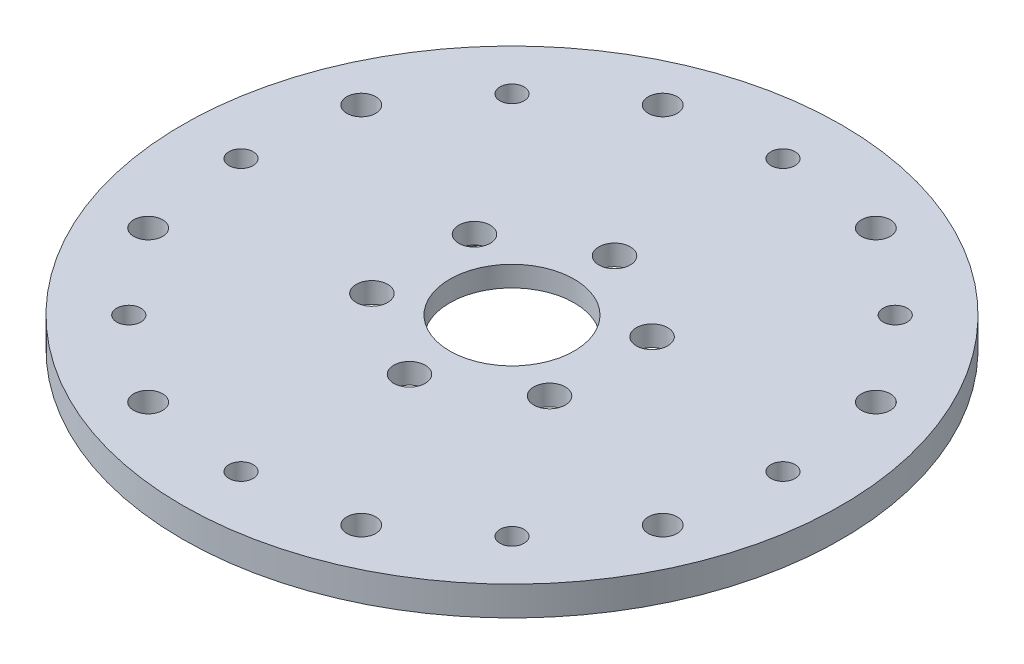
ISO-10303-21;
HEADER;
FILE_DESCRIPTION(('STEP AP214'),'2;1');
FILE_NAME('part.step','',(''),(''),'','','');
FILE_SCHEMA(('AUTOMOTIVE_DESIGN { 1 0 10303 214 1 1 1 1 }'));
ENDSEC;
DATA;
#1=APPLICATION_CONTEXT('core data for automotive mechanical design processes');
#2=APPLICATION_PROTOCOL_DEFINITION('international standard','automotive_design',2000,#1);
#3=PRODUCT_CONTEXT('',#1,'mechanical');
#4=PRODUCT('Part','Part','',(#3));
#5=PRODUCT_RELATED_PRODUCT_CATEGORY('part','',(#4));
#6=PRODUCT_DEFINITION_FORMATION('','',#4);
#7=PRODUCT_DEFINITION_CONTEXT('part definition',#1,'design');
#8=PRODUCT_DEFINITION('design','',#6,#7);
#9=PRODUCT_DEFINITION_SHAPE('','',#8);
#10=(LENGTH_UNIT() NAMED_UNIT(*) SI_UNIT(.MILLI.,.METRE.));
#11=(NAMED_UNIT(*) PLANE_ANGLE_UNIT() SI_UNIT($,.RADIAN.));
#12=(NAMED_UNIT(*) SI_UNIT($,.STERADIAN.) SOLID_ANGLE_UNIT());
#13=UNCERTAINTY_MEASURE_WITH_UNIT(LENGTH_MEASURE(1.E-05),#10,'distance_accuracy_value','');
#14=(GEOMETRIC_REPRESENTATION_CONTEXT(3) GLOBAL_UNCERTAINTY_ASSIGNED_CONTEXT((#13)) GLOBAL_UNIT_ASSIGNED_CONTEXT((#10,
#11,#12)) REPRESENTATION_CONTEXT('',''));
#15=CARTESIAN_POINT('',(0.,0.,0.));
#16=DIRECTION('',(0.,0.,1.));
#17=DIRECTION('',(1.,0.,0.));
#18=AXIS2_PLACEMENT_3D('',#15,#16,#17);
#19=CARTESIAN_POINT('',(0.,0.,-14.));
#20=DIRECTION('',(0.,1.,0.));
#21=DIRECTION('',(0.,0.,1.));
#22=AXIS2_PLACEMENT_3D('',#19,#20,#21);
#23=CYLINDRICAL_SURFACE('',#22,2.15);
#24=CARTESIAN_POINT('',(0.,4.,-14.));
#25=DIRECTION('',(0.,1.,0.));
#26=DIRECTION('',(0.,0.,1.));
#27=AXIS2_PLACEMENT_3D('',#24,#25,#26);
#28=CIRCLE('',#27,2.15);
#29=CARTESIAN_POINT('',(0.,4.,-11.85));
#30=VERTEX_POINT('',#29);
#31=EDGE_CURVE('E52',#30,#30,#28,.T.);
#32=ORIENTED_EDGE('',*,*,#31,.T.);
#33=EDGE_LOOP('',(#32));
#34=FACE_BOUND('',#33,.T.);
#35=CARTESIAN_POINT('',(0.,1.2,-14.));
#36=DIRECTION('',(0.,-1.,0.));
#37=DIRECTION('',(0.,0.,-1.));
#38=AXIS2_PLACEMENT_3D('',#35,#36,#37);
#39=CIRCLE('',#38,2.15);
#40=CARTESIAN_POINT('',(0.,1.2,-16.15));
#41=VERTEX_POINT('',#40);
#42=EDGE_CURVE('E115',#41,#41,#39,.F.);
#43=ORIENTED_EDGE('',*,*,#42,.F.);
#44=EDGE_LOOP('',(#43));
#45=FACE_BOUND('',#44,.T.);
#46=ADVANCED_FACE('F39',(#34,#45),#23,.F.);
#47=CARTESIAN_POINT('',(-12.1243556529822,0.,-6.99999999999997));
#48=DIRECTION('',(0.,1.,0.));
#49=DIRECTION('',(0.,0.,1.));
#50=AXIS2_PLACEMENT_3D('',#47,#48,#49);
#51=CYLINDRICAL_SURFACE('',#50,2.15);
#52=CARTESIAN_POINT('',(-12.1243556529822,4.,-6.99999999999997));
#53=DIRECTION('',(0.,1.,0.));
#54=DIRECTION('',(0.86602540378444,0.,0.499999999999998));
#55=AXIS2_PLACEMENT_3D('',#52,#53,#54);
#56=CIRCLE('',#55,2.15);
#57=CARTESIAN_POINT('',(-10.2624010348456,4.,-5.92499999999998));
#58=VERTEX_POINT('',#57);
#59=EDGE_CURVE('E56',#58,#58,#56,.T.);
#60=ORIENTED_EDGE('',*,*,#59,.T.);
#61=EDGE_LOOP('',(#60));
#62=FACE_BOUND('',#61,.T.);
#63=CARTESIAN_POINT('',(-12.1243556529822,1.2,-6.99999999999997));
#64=DIRECTION('',(0.,-1.,0.));
#65=DIRECTION('',(0.,0.,-1.));
#66=AXIS2_PLACEMENT_3D('',#63,#64,#65);
#67=CIRCLE('',#66,2.15);
#68=CARTESIAN_POINT('',(-12.1243556529822,1.2,-9.14999999999997));
#69=VERTEX_POINT('',#68);
#70=EDGE_CURVE('E125',#69,#69,#67,.F.);
#71=ORIENTED_EDGE('',*,*,#70,.F.);
#72=EDGE_LOOP('',(#71));
#73=FACE_BOUND('',#72,.T.);
#74=ADVANCED_FACE('F255',(#62,#73),#51,.F.);
#75=CARTESIAN_POINT('',(-12.1243556529821,0.,7.00000000000006));
#76=DIRECTION('',(0.,1.,0.));
#77=DIRECTION('',(0.,0.,1.));
#78=AXIS2_PLACEMENT_3D('',#75,#76,#77);
#79=CYLINDRICAL_SURFACE('',#78,2.15);
#80=CARTESIAN_POINT('',(-12.1243556529821,4.,7.00000000000006));
#81=DIRECTION('',(0.,1.,0.));
#82=DIRECTION('',(0.866025403784436,0.,-0.500000000000004));
#83=AXIS2_PLACEMENT_3D('',#80,#81,#82);
#84=CIRCLE('',#83,2.15);
#85=CARTESIAN_POINT('',(-10.2624010348456,4.,5.92500000000005));
#86=VERTEX_POINT('',#85);
#87=EDGE_CURVE('E59',#86,#86,#84,.T.);
#88=ORIENTED_EDGE('',*,*,#87,.T.);
#89=EDGE_LOOP('',(#88));
#90=FACE_BOUND('',#89,.T.);
#91=CARTESIAN_POINT('',(-12.1243556529821,1.2,7.00000000000006));
#92=DIRECTION('',(0.,-1.,0.));
#93=DIRECTION('',(0.,0.,-1.));
#94=AXIS2_PLACEMENT_3D('',#91,#92,#93);
#95=CIRCLE('',#94,2.15);
#96=CARTESIAN_POINT('',(-12.1243556529821,1.2,4.85000000000006));
#97=VERTEX_POINT('',#96);
#98=EDGE_CURVE('E128',#97,#97,#95,.F.);
#99=ORIENTED_EDGE('',*,*,#98,.F.);
#100=EDGE_LOOP('',(#99));
#101=FACE_BOUND('',#100,.T.);
#102=ADVANCED_FACE('F311',(#90,#101),#79,.F.);
#103=CARTESIAN_POINT('',(0.,0.,14.));
#104=DIRECTION('',(0.,1.,0.));
#105=DIRECTION('',(0.,0.,1.));
#106=AXIS2_PLACEMENT_3D('',#103,#104,#105);
#107=CYLINDRICAL_SURFACE('',#106,2.15);
#108=CARTESIAN_POINT('',(0.,4.,14.));
#109=DIRECTION('',(0.,1.,0.));
#110=DIRECTION('',(0.,0.,-1.));
#111=AXIS2_PLACEMENT_3D('',#108,#109,#110);
#112=CIRCLE('',#111,2.15);
#113=CARTESIAN_POINT('',(0.,4.,11.85));
#114=VERTEX_POINT('',#113);
#115=EDGE_CURVE('E67',#114,#114,#112,.T.);
#116=ORIENTED_EDGE('',*,*,#115,.T.);
#117=EDGE_LOOP('',(#116));
#118=FACE_BOUND('',#117,.T.);
#119=CARTESIAN_POINT('',(0.,1.2,14.));
#120=DIRECTION('',(0.,-1.,0.));
#121=DIRECTION('',(0.,0.,-1.));
#122=AXIS2_PLACEMENT_3D('',#119,#120,#121);
#123=CIRCLE('',#122,2.15);
#124=CARTESIAN_POINT('',(0.,1.2,11.85));
#125=VERTEX_POINT('',#124);
#126=EDGE_CURVE('E131',#125,#125,#123,.F.);
#127=ORIENTED_EDGE('',*,*,#126,.F.);
#128=EDGE_LOOP('',(#127));
#129=FACE_BOUND('',#128,.T.);
#130=ADVANCED_FACE('F314',(#118,#129),#107,.F.);
#131=CARTESIAN_POINT('',(12.1243556529822,0.,6.99999999999989));
#132=DIRECTION('',(0.,1.,0.));
#133=DIRECTION('',(0.,0.,1.));
#134=AXIS2_PLACEMENT_3D('',#131,#132,#133);
#135=CYLINDRICAL_SURFACE('',#134,2.15);
#136=CARTESIAN_POINT('',(12.1243556529822,4.,6.99999999999989));
#137=DIRECTION('',(0.,1.,0.));
#138=DIRECTION('',(-0.866025403784443,0.,-0.499999999999992));
#139=AXIS2_PLACEMENT_3D('',#136,#137,#138);
#140=CIRCLE('',#139,2.15);
#141=CARTESIAN_POINT('',(10.2624010348457,4.,5.9249999999999));
#142=VERTEX_POINT('',#141);
#143=EDGE_CURVE('E63',#142,#142,#140,.T.);
#144=ORIENTED_EDGE('',*,*,#143,.T.);
#145=EDGE_LOOP('',(#144));
#146=FACE_BOUND('',#145,.T.);
#147=CARTESIAN_POINT('',(12.1243556529822,1.2,6.99999999999989));
#148=DIRECTION('',(0.,-1.,0.));
#149=DIRECTION('',(0.,0.,-1.));
#150=AXIS2_PLACEMENT_3D('',#147,#148,#149);
#151=CIRCLE('',#150,2.15);
#152=CARTESIAN_POINT('',(12.1243556529822,1.2,4.84999999999989));
#153=VERTEX_POINT('',#152);
#154=EDGE_CURVE('E134',#153,#153,#151,.F.);
#155=ORIENTED_EDGE('',*,*,#154,.F.);
#156=EDGE_LOOP('',(#155));
#157=FACE_BOUND('',#156,.T.);
#158=ADVANCED_FACE('F318',(#146,#157),#135,.F.);
#159=CARTESIAN_POINT('',(12.1243556529821,0.,-7.00000000000014));
#160=DIRECTION('',(0.,1.,0.));
#161=DIRECTION('',(0.,0.,1.));
#162=AXIS2_PLACEMENT_3D('',#159,#160,#161);
#163=CYLINDRICAL_SURFACE('',#162,2.15);
#164=CARTESIAN_POINT('',(12.1243556529821,4.,-7.00000000000014));
#165=DIRECTION('',(0.,1.,0.));
#166=DIRECTION('',(-0.866025403784433,0.,0.50000000000001));
#167=AXIS2_PLACEMENT_3D('',#164,#165,#166);
#168=CIRCLE('',#167,2.15);
#169=CARTESIAN_POINT('',(10.2624010348455,4.,-5.92500000000012));
#170=VERTEX_POINT('',#169);
#171=EDGE_CURVE('E60',#170,#170,#168,.T.);
#172=ORIENTED_EDGE('',*,*,#171,.T.);
#173=EDGE_LOOP('',(#172));
#174=FACE_BOUND('',#173,.T.);
#175=CARTESIAN_POINT('',(12.1243556529821,1.2,-7.00000000000014));
#176=DIRECTION('',(0.,-1.,0.));
#177=DIRECTION('',(0.,0.,-1.));
#178=AXIS2_PLACEMENT_3D('',#175,#176,#177);
#179=CIRCLE('',#178,2.15);
#180=CARTESIAN_POINT('',(12.1243556529821,1.2,-9.15000000000014));
#181=VERTEX_POINT('',#180);
#182=EDGE_CURVE('E137',#181,#181,#179,.F.);
#183=ORIENTED_EDGE('',*,*,#182,.F.);
#184=EDGE_LOOP('',(#183));
#185=FACE_BOUND('',#184,.T.);
#186=ADVANCED_FACE('F309',(#174,#185),#163,.F.);
#187=CARTESIAN_POINT('',(0.,0.,0.));
#188=DIRECTION('',(0.,1.,0.));
#189=DIRECTION('',(0.,0.,1.));
#190=AXIS2_PLACEMENT_3D('',#187,#188,#189);
#191=CYLINDRICAL_SURFACE('',#190,8.5);
#192=CARTESIAN_POINT('',(0.,4.,0.));
#193=DIRECTION('',(0.,1.,0.));
#194=DIRECTION('',(0.,0.,1.));
#195=AXIS2_PLACEMENT_3D('',#192,#193,#194);
#196=CIRCLE('',#195,8.5);
#197=CARTESIAN_POINT('',(0.,4.,8.5));
#198=VERTEX_POINT('',#197);
#199=EDGE_CURVE('E64',#198,#198,#196,.T.);
#200=ORIENTED_EDGE('',*,*,#199,.T.);
#201=EDGE_LOOP('',(#200));
#202=FACE_BOUND('',#201,.T.);
#203=CARTESIAN_POINT('',(0.,1.2,0.));
#204=DIRECTION('',(0.,-1.,0.));
#205=DIRECTION('',(0.,0.,-1.));
#206=AXIS2_PLACEMENT_3D('',#203,#204,#205);
#207=CIRCLE('',#206,8.5);
#208=CARTESIAN_POINT('',(0.,1.2,-8.5));
#209=VERTEX_POINT('',#208);
#210=EDGE_CURVE('E43',#209,#209,#207,.F.);
#211=ORIENTED_EDGE('',*,*,#210,.F.);
#212=EDGE_LOOP('',(#211));
#213=FACE_BOUND('',#212,.T.);
#214=ADVANCED_FACE('F307',(#202,#213),#191,.F.);
#215=CARTESIAN_POINT('',(0.,4.,0.));
#216=DIRECTION('',(0.,-1.,0.));
#217=DIRECTION('',(0.,0.,-1.));
#218=AXIS2_PLACEMENT_3D('',#215,#216,#217);
#219=CYLINDRICAL_SURFACE('',#218,45.);
#220=CARTESIAN_POINT('',(0.,4.,0.));
#221=DIRECTION('',(0.,1.,0.));
#222=DIRECTION('',(0.,0.,1.));
#223=AXIS2_PLACEMENT_3D('',#220,#221,#222);
#224=CIRCLE('',#223,45.);
#225=CARTESIAN_POINT('',(0.,4.,45.));
#226=VERTEX_POINT('',#225);
#227=EDGE_CURVE('E10',#226,#226,#224,.T.);
#228=ORIENTED_EDGE('',*,*,#227,.F.);
#229=EDGE_LOOP('',(#228));
#230=FACE_BOUND('',#229,.T.);
#231=CARTESIAN_POINT('',(0.,0.,0.));
#232=DIRECTION('',(0.,1.,0.));
#233=DIRECTION('',(0.,0.,1.));
#234=AXIS2_PLACEMENT_3D('',#231,#232,#233);
#235=CIRCLE('',#234,45.);
#236=CARTESIAN_POINT('',(0.,0.,45.));
#237=VERTEX_POINT('',#236);
#238=EDGE_CURVE('E47',#237,#237,#235,.T.);
#239=ORIENTED_EDGE('',*,*,#238,.T.);
#240=EDGE_LOOP('',(#239));
#241=FACE_BOUND('',#240,.T.);
#242=ADVANCED_FACE('F41',(#230,#241),#219,.T.);
#243=CARTESIAN_POINT('',(0.,4.,0.));
#244=DIRECTION('',(0.,1.,0.));
#245=DIRECTION('',(0.,0.,1.));
#246=AXIS2_PLACEMENT_3D('',#243,#244,#245);
#247=PLANE('',#246);
#248=CARTESIAN_POINT('',(-14.5515375156822,4.,35.1305192237413));
#249=DIRECTION('',(0.,1.,0.));
#250=DIRECTION('',(-0.707106781186549,0.,0.707106781186546));
#251=AXIS2_PLACEMENT_3D('',#248,#249,#250);
#252=CIRCLE('',#251,1.975);
#253=CARTESIAN_POINT('',(-15.9480734085257,4.,36.5270551165847));
#254=VERTEX_POINT('',#253);
#255=EDGE_CURVE('E189',#254,#254,#252,.T.);
#256=ORIENTED_EDGE('',*,*,#255,.F.);
#257=EDGE_LOOP('',(#256));
#258=FACE_BOUND('',#257,.T.);
#259=CARTESIAN_POINT('',(-35.1305192237412,4.,14.5515375156824));
#260=DIRECTION('',(0.,1.,0.));
#261=DIRECTION('',(-1.,0.,0.));
#262=AXIS2_PLACEMENT_3D('',#259,#260,#261);
#263=CIRCLE('',#262,1.975);
#264=CARTESIAN_POINT('',(-37.1055192237412,4.,14.5515375156824));
#265=VERTEX_POINT('',#264);
#266=EDGE_CURVE('E183',#265,#265,#263,.T.);
#267=ORIENTED_EDGE('',*,*,#266,.F.);
#268=EDGE_LOOP('',(#267));
#269=FACE_BOUND('',#268,.T.);
#270=CARTESIAN_POINT('',(-35.1305192237412,4.,-14.5515375156824));
#271=DIRECTION('',(0.,1.,0.));
#272=DIRECTION('',(-0.707106781186544,0.,-0.707106781186551));
#273=AXIS2_PLACEMENT_3D('',#270,#271,#272);
#274=CIRCLE('',#273,1.975);
#275=CARTESIAN_POINT('',(-36.5270551165846,4.,-15.9480734085258));
#276=VERTEX_POINT('',#275);
#277=EDGE_CURVE('E177',#276,#276,#274,.T.);
#278=ORIENTED_EDGE('',*,*,#277,.F.);
#279=EDGE_LOOP('',(#278));
#280=FACE_BOUND('',#279,.T.);
#281=CARTESIAN_POINT('',(-14.5515375156825,4.,-35.1305192237411));
#282=DIRECTION('',(0.,1.,0.));
#283=DIRECTION('',(0.,0.,-1.));
#284=AXIS2_PLACEMENT_3D('',#281,#282,#283);
#285=CIRCLE('',#284,1.975);
#286=CARTESIAN_POINT('',(-14.5515375156825,4.,-37.1055192237411));
#287=VERTEX_POINT('',#286);
#288=EDGE_CURVE('E171',#287,#287,#285,.T.);
#289=ORIENTED_EDGE('',*,*,#288,.F.);
#290=EDGE_LOOP('',(#289));
#291=FACE_BOUND('',#290,.T.);
#292=CARTESIAN_POINT('',(14.5515375156825,4.,-35.1305192237412));
#293=DIRECTION('',(0.,1.,0.));
#294=DIRECTION('',(0.707106781186554,0.,-0.707106781186541));
#295=AXIS2_PLACEMENT_3D('',#292,#293,#294);
#296=CIRCLE('',#295,1.975);
#297=CARTESIAN_POINT('',(15.9480734085259,4.,-36.5270551165846));
#298=VERTEX_POINT('',#297);
#299=EDGE_CURVE('E165',#298,#298,#296,.T.);
#300=ORIENTED_EDGE('',*,*,#299,.F.);
#301=EDGE_LOOP('',(#300));
#302=FACE_BOUND('',#301,.T.);
#303=CARTESIAN_POINT('',(35.1305192237413,4.,-14.5515375156822));
#304=DIRECTION('',(0.,1.,0.));
#305=DIRECTION('',(1.,0.,0.));
#306=AXIS2_PLACEMENT_3D('',#303,#304,#305);
#307=CIRCLE('',#306,1.975);
#308=CARTESIAN_POINT('',(37.1055192237413,4.,-14.5515375156821));
#309=VERTEX_POINT('',#308);
#310=EDGE_CURVE('E159',#309,#309,#307,.T.);
#311=ORIENTED_EDGE('',*,*,#310,.F.);
#312=EDGE_LOOP('',(#311));
#313=FACE_BOUND('',#312,.T.);
#314=CARTESIAN_POINT('',(35.1305192237411,4.,14.5515375156826));
#315=DIRECTION('',(0.,1.,0.));
#316=DIRECTION('',(0.707106781186539,0.,0.707106781186556));
#317=AXIS2_PLACEMENT_3D('',#314,#315,#316);
#318=CIRCLE('',#317,1.975);
#319=CARTESIAN_POINT('',(36.5270551165845,4.,15.948073408526));
#320=VERTEX_POINT('',#319);
#321=EDGE_CURVE('E153',#320,#320,#318,.T.);
#322=ORIENTED_EDGE('',*,*,#321,.F.);
#323=EDGE_LOOP('',(#322));
#324=FACE_BOUND('',#323,.T.);
#325=CARTESIAN_POINT('',(14.5515375156825,4.,35.1305192237411));
#326=DIRECTION('',(0.,1.,0.));
#327=DIRECTION('',(0.,0.,1.));
#328=AXIS2_PLACEMENT_3D('',#325,#326,#327);
#329=CIRCLE('',#328,1.975);
#330=CARTESIAN_POINT('',(14.5515375156825,4.,37.1055192237411));
#331=VERTEX_POINT('',#330);
#332=EDGE_CURVE('E147',#331,#331,#329,.T.);
#333=ORIENTED_EDGE('',*,*,#332,.F.);
#334=EDGE_LOOP('',(#333));
#335=FACE_BOUND('',#334,.T.);
#336=CARTESIAN_POINT('',(37.,4.,1.29184809537196E-13));
#337=DIRECTION('',(0.,1.,0.));
#338=DIRECTION('',(-1.,0.,0.));
#339=AXIS2_PLACEMENT_3D('',#336,#337,#338);
#340=CIRCLE('',#339,1.65);
#341=CARTESIAN_POINT('',(35.35,4.,1.23423865328105E-13));
#342=VERTEX_POINT('',#341);
#343=EDGE_CURVE('E106',#342,#342,#340,.T.);
#344=ORIENTED_EDGE('',*,*,#343,.F.);
#345=EDGE_LOOP('',(#344));
#346=FACE_BOUND('',#345,.T.);
#347=CARTESIAN_POINT('',(26.1629509039021,4.,26.1629509039024));
#348=DIRECTION('',(0.,1.,0.));
#349=DIRECTION('',(-0.707106781186544,0.,-0.707106781186551));
#350=AXIS2_PLACEMENT_3D('',#347,#348,#349);
#351=CIRCLE('',#350,1.65);
#352=CARTESIAN_POINT('',(24.9962247149443,4.,24.9962247149446));
#353=VERTEX_POINT('',#352);
#354=EDGE_CURVE('E100',#353,#353,#351,.T.);
#355=ORIENTED_EDGE('',*,*,#354,.F.);
#356=EDGE_LOOP('',(#355));
#357=FACE_BOUND('',#356,.T.);
#358=CARTESIAN_POINT('',(0.,4.,37.));
#359=DIRECTION('',(0.,1.,0.));
#360=DIRECTION('',(0.,0.,-1.));
#361=AXIS2_PLACEMENT_3D('',#358,#359,#360);
#362=CIRCLE('',#361,1.65);
#363=CARTESIAN_POINT('',(0.,4.,35.35));
#364=VERTEX_POINT('',#363);
#365=EDGE_CURVE('E94',#364,#364,#362,.T.);
#366=ORIENTED_EDGE('',*,*,#365,.F.);
#367=EDGE_LOOP('',(#366));
#368=FACE_BOUND('',#367,.T.);
#369=CARTESIAN_POINT('',(-26.1629509039025,4.,26.162950903902));
#370=DIRECTION('',(0.,1.,0.));
#371=DIRECTION('',(0.707106781186554,0.,-0.707106781186541));
#372=AXIS2_PLACEMENT_3D('',#369,#370,#371);
#373=CIRCLE('',#372,1.65);
#374=CARTESIAN_POINT('',(-24.9962247149447,4.,24.9962247149442));
#375=VERTEX_POINT('',#374);
#376=EDGE_CURVE('E87',#375,#375,#373,.T.);
#377=ORIENTED_EDGE('',*,*,#376,.F.);
#378=EDGE_LOOP('',(#377));
#379=FACE_BOUND('',#378,.T.);
#380=CARTESIAN_POINT('',(-37.,4.,-3.87554428611588E-13));
#381=DIRECTION('',(0.,1.,0.));
#382=DIRECTION('',(1.,0.,0.));
#383=AXIS2_PLACEMENT_3D('',#380,#381,#382);
#384=CIRCLE('',#383,1.65);
#385=CARTESIAN_POINT('',(-35.35,4.,-3.70271595984314E-13));
#386=VERTEX_POINT('',#385);
#387=EDGE_CURVE('E118',#386,#386,#384,.T.);
#388=ORIENTED_EDGE('',*,*,#387,.F.);
#389=EDGE_LOOP('',(#388));
#390=FACE_BOUND('',#389,.T.);
#391=CARTESIAN_POINT('',(-26.1629509039019,4.,-26.1629509039026));
#392=DIRECTION('',(0.,1.,0.));
#393=DIRECTION('',(0.707106781186539,0.,0.707106781186556));
#394=AXIS2_PLACEMENT_3D('',#391,#392,#393);
#395=CIRCLE('',#394,1.65);
#396=CARTESIAN_POINT('',(-24.9962247149442,4.,-24.9962247149448));
#397=VERTEX_POINT('',#396);
#398=EDGE_CURVE('E111',#397,#397,#395,.T.);
#399=ORIENTED_EDGE('',*,*,#398,.F.);
#400=EDGE_LOOP('',(#399));
#401=FACE_BOUND('',#400,.T.);
#402=CARTESIAN_POINT('',(26.1629509039023,4.,-26.1629509039022));
#403=DIRECTION('',(0.,1.,0.));
#404=DIRECTION('',(-0.707106781186549,0.,0.707106781186546));
#405=AXIS2_PLACEMENT_3D('',#402,#403,#404);
#406=CIRCLE('',#405,1.65);
#407=CARTESIAN_POINT('',(24.9962247149445,4.,-24.9962247149444));
#408=VERTEX_POINT('',#407);
#409=EDGE_CURVE('E81',#408,#408,#406,.T.);
#410=ORIENTED_EDGE('',*,*,#409,.F.);
#411=EDGE_LOOP('',(#410));
#412=FACE_BOUND('',#411,.T.);
#413=CARTESIAN_POINT('',(0.,4.,-37.));
#414=DIRECTION('',(0.,1.,0.));
#415=DIRECTION('',(0.,0.,1.));
#416=AXIS2_PLACEMENT_3D('',#413,#414,#415);
#417=CIRCLE('',#416,1.65);
#418=CARTESIAN_POINT('',(0.,4.,-35.35));
#419=VERTEX_POINT('',#418);
#420=EDGE_CURVE('E75',#419,#419,#417,.T.);
#421=ORIENTED_EDGE('',*,*,#420,.F.);
#422=EDGE_LOOP('',(#421));
#423=FACE_BOUND('',#422,.T.);
#424=ORIENTED_EDGE('',*,*,#199,.F.);
#425=EDGE_LOOP('',(#424));
#426=FACE_BOUND('',#425,.T.);
#427=ORIENTED_EDGE('',*,*,#171,.F.);
#428=EDGE_LOOP('',(#427));
#429=FACE_BOUND('',#428,.T.);
#430=ORIENTED_EDGE('',*,*,#143,.F.);
#431=EDGE_LOOP('',(#430));
#432=FACE_BOUND('',#431,.T.);
#433=ORIENTED_EDGE('',*,*,#115,.F.);
#434=EDGE_LOOP('',(#433));
#435=FACE_BOUND('',#434,.T.);
#436=ORIENTED_EDGE('',*,*,#87,.F.);
#437=EDGE_LOOP('',(#436));
#438=FACE_BOUND('',#437,.T.);
#439=ORIENTED_EDGE('',*,*,#59,.F.);
#440=EDGE_LOOP('',(#439));
#441=FACE_BOUND('',#440,.T.);
#442=ORIENTED_EDGE('',*,*,#31,.F.);
#443=EDGE_LOOP('',(#442));
#444=FACE_BOUND('',#443,.T.);
#445=ORIENTED_EDGE('',*,*,#227,.T.);
#446=EDGE_LOOP('',(#445));
#447=FACE_BOUND('',#446,.T.);
#448=ADVANCED_FACE('F205',(#258,#269,#280,#291,#302,#313,#324,#335,#346,#357,#368,#379,#390,
#401,#412,#423,#426,#429,#432,#435,#438,#441,#444,#447),#247,.T.);
#449=CARTESIAN_POINT('',(0.,0.,0.));
#450=DIRECTION('',(0.,1.,0.));
#451=DIRECTION('',(0.,0.,1.));
#452=AXIS2_PLACEMENT_3D('',#449,#450,#451);
#453=PLANE('',#452);
#454=CARTESIAN_POINT('',(-14.5515375156822,0.,35.1305192237413));
#455=DIRECTION('',(0.,1.,0.));
#456=DIRECTION('',(-0.707106781186549,0.,0.707106781186546));
#457=AXIS2_PLACEMENT_3D('',#454,#455,#456);
#458=CIRCLE('',#457,1.975);
#459=CARTESIAN_POINT('',(-15.9480734085257,0.,36.5270551165847));
#460=VERTEX_POINT('',#459);
#461=EDGE_CURVE('E150',#460,#460,#458,.T.);
#462=ORIENTED_EDGE('',*,*,#461,.T.);
#463=EDGE_LOOP('',(#462));
#464=FACE_BOUND('',#463,.T.);
#465=CARTESIAN_POINT('',(-35.1305192237412,0.,14.5515375156824));
#466=DIRECTION('',(0.,1.,0.));
#467=DIRECTION('',(-1.,0.,0.));
#468=AXIS2_PLACEMENT_3D('',#465,#466,#467);
#469=CIRCLE('',#468,1.975);
#470=CARTESIAN_POINT('',(-37.1055192237412,0.,14.5515375156824));
#471=VERTEX_POINT('',#470);
#472=EDGE_CURVE('E186',#471,#471,#469,.T.);
#473=ORIENTED_EDGE('',*,*,#472,.T.);
#474=EDGE_LOOP('',(#473));
#475=FACE_BOUND('',#474,.T.);
#476=CARTESIAN_POINT('',(-35.1305192237412,0.,-14.5515375156824));
#477=DIRECTION('',(0.,1.,0.));
#478=DIRECTION('',(-0.707106781186544,0.,-0.707106781186551));
#479=AXIS2_PLACEMENT_3D('',#476,#477,#478);
#480=CIRCLE('',#479,1.975);
#481=CARTESIAN_POINT('',(-36.5270551165846,0.,-15.9480734085258));
#482=VERTEX_POINT('',#481);
#483=EDGE_CURVE('E180',#482,#482,#480,.T.);
#484=ORIENTED_EDGE('',*,*,#483,.T.);
#485=EDGE_LOOP('',(#484));
#486=FACE_BOUND('',#485,.T.);
#487=CARTESIAN_POINT('',(-14.5515375156825,0.,-35.1305192237411));
#488=DIRECTION('',(0.,1.,0.));
#489=DIRECTION('',(0.,0.,-1.));
#490=AXIS2_PLACEMENT_3D('',#487,#488,#489);
#491=CIRCLE('',#490,1.975);
#492=CARTESIAN_POINT('',(-14.5515375156825,0.,-37.1055192237411));
#493=VERTEX_POINT('',#492);
#494=EDGE_CURVE('E174',#493,#493,#491,.T.);
#495=ORIENTED_EDGE('',*,*,#494,.T.);
#496=EDGE_LOOP('',(#495));
#497=FACE_BOUND('',#496,.T.);
#498=CARTESIAN_POINT('',(14.5515375156825,0.,-35.1305192237412));
#499=DIRECTION('',(0.,1.,0.));
#500=DIRECTION('',(0.707106781186554,0.,-0.707106781186541));
#501=AXIS2_PLACEMENT_3D('',#498,#499,#500);
#502=CIRCLE('',#501,1.975);
#503=CARTESIAN_POINT('',(15.9480734085259,0.,-36.5270551165846));
#504=VERTEX_POINT('',#503);
#505=EDGE_CURVE('E168',#504,#504,#502,.T.);
#506=ORIENTED_EDGE('',*,*,#505,.T.);
#507=EDGE_LOOP('',(#506));
#508=FACE_BOUND('',#507,.T.);
#509=CARTESIAN_POINT('',(35.1305192237413,0.,-14.5515375156822));
#510=DIRECTION('',(0.,1.,0.));
#511=DIRECTION('',(1.,0.,0.));
#512=AXIS2_PLACEMENT_3D('',#509,#510,#511);
#513=CIRCLE('',#512,1.975);
#514=CARTESIAN_POINT('',(37.1055192237413,0.,-14.5515375156821));
#515=VERTEX_POINT('',#514);
#516=EDGE_CURVE('E162',#515,#515,#513,.T.);
#517=ORIENTED_EDGE('',*,*,#516,.T.);
#518=EDGE_LOOP('',(#517));
#519=FACE_BOUND('',#518,.T.);
#520=CARTESIAN_POINT('',(35.1305192237411,0.,14.5515375156826));
#521=DIRECTION('',(0.,1.,0.));
#522=DIRECTION('',(0.707106781186539,0.,0.707106781186556));
#523=AXIS2_PLACEMENT_3D('',#520,#521,#522);
#524=CIRCLE('',#523,1.975);
#525=CARTESIAN_POINT('',(36.5270551165845,0.,15.948073408526));
#526=VERTEX_POINT('',#525);
#527=EDGE_CURVE('E156',#526,#526,#524,.T.);
#528=ORIENTED_EDGE('',*,*,#527,.T.);
#529=EDGE_LOOP('',(#528));
#530=FACE_BOUND('',#529,.T.);
#531=CARTESIAN_POINT('',(14.5515375156825,0.,35.1305192237411));
#532=DIRECTION('',(0.,1.,0.));
#533=DIRECTION('',(0.,0.,1.));
#534=AXIS2_PLACEMENT_3D('',#531,#532,#533);
#535=CIRCLE('',#534,1.975);
#536=CARTESIAN_POINT('',(14.5515375156825,0.,37.1055192237411));
#537=VERTEX_POINT('',#536);
#538=EDGE_CURVE('E144',#537,#537,#535,.T.);
#539=ORIENTED_EDGE('',*,*,#538,.T.);
#540=EDGE_LOOP('',(#539));
#541=FACE_BOUND('',#540,.T.);
#542=CARTESIAN_POINT('',(0.,0.,-5.18725890093924E-13));
#543=DIRECTION('',(0.,-1.,0.));
#544=DIRECTION('',(0.,0.,-1.));
#545=AXIS2_PLACEMENT_3D('',#542,#543,#544);
#546=CIRCLE('',#545,17.6000000000002);
#547=CARTESIAN_POINT('',(0.,0.,-17.6000000000007));
#548=VERTEX_POINT('',#547);
#549=EDGE_CURVE('E140',#548,#548,#546,.T.);
#550=ORIENTED_EDGE('',*,*,#549,.F.);
#551=EDGE_LOOP('',(#550));
#552=FACE_BOUND('',#551,.T.);
#553=CARTESIAN_POINT('',(37.,0.,1.29184809537196E-13));
#554=DIRECTION('',(0.,1.,0.));
#555=DIRECTION('',(-1.,0.,0.));
#556=AXIS2_PLACEMENT_3D('',#553,#554,#555);
#557=CIRCLE('',#556,1.65);
#558=CARTESIAN_POINT('',(35.35,0.,1.23423865328105E-13));
#559=VERTEX_POINT('',#558);
#560=EDGE_CURVE('E84',#559,#559,#557,.T.);
#561=ORIENTED_EDGE('',*,*,#560,.T.);
#562=EDGE_LOOP('',(#561));
#563=FACE_BOUND('',#562,.T.);
#564=CARTESIAN_POINT('',(26.1629509039021,0.,26.1629509039024));
#565=DIRECTION('',(0.,1.,0.));
#566=DIRECTION('',(-0.707106781186544,0.,-0.707106781186551));
#567=AXIS2_PLACEMENT_3D('',#564,#565,#566);
#568=CIRCLE('',#567,1.65);
#569=CARTESIAN_POINT('',(24.9962247149443,0.,24.9962247149446));
#570=VERTEX_POINT('',#569);
#571=EDGE_CURVE('E103',#570,#570,#568,.T.);
#572=ORIENTED_EDGE('',*,*,#571,.T.);
#573=EDGE_LOOP('',(#572));
#574=FACE_BOUND('',#573,.T.);
#575=CARTESIAN_POINT('',(0.,0.,37.));
#576=DIRECTION('',(0.,1.,0.));
#577=DIRECTION('',(0.,0.,-1.));
#578=AXIS2_PLACEMENT_3D('',#575,#576,#577);
#579=CIRCLE('',#578,1.65);
#580=CARTESIAN_POINT('',(0.,0.,35.35));
#581=VERTEX_POINT('',#580);
#582=EDGE_CURVE('E97',#581,#581,#579,.T.);
#583=ORIENTED_EDGE('',*,*,#582,.T.);
#584=EDGE_LOOP('',(#583));
#585=FACE_BOUND('',#584,.T.);
#586=CARTESIAN_POINT('',(-26.1629509039025,0.,26.162950903902));
#587=DIRECTION('',(0.,1.,0.));
#588=DIRECTION('',(0.707106781186554,0.,-0.707106781186541));
#589=AXIS2_PLACEMENT_3D('',#586,#587,#588);
#590=CIRCLE('',#589,1.65);
#591=CARTESIAN_POINT('',(-24.9962247149447,0.,24.9962247149442));
#592=VERTEX_POINT('',#591);
#593=EDGE_CURVE('E90',#592,#592,#590,.T.);
#594=ORIENTED_EDGE('',*,*,#593,.T.);
#595=EDGE_LOOP('',(#594));
#596=FACE_BOUND('',#595,.T.);
#597=CARTESIAN_POINT('',(-37.,0.,-3.87554428611588E-13));
#598=DIRECTION('',(0.,1.,0.));
#599=DIRECTION('',(1.,0.,0.));
#600=AXIS2_PLACEMENT_3D('',#597,#598,#599);
#601=CIRCLE('',#600,1.65);
#602=CARTESIAN_POINT('',(-35.35,0.,-3.70271595984314E-13));
#603=VERTEX_POINT('',#602);
#604=EDGE_CURVE('E91',#603,#603,#601,.T.);
#605=ORIENTED_EDGE('',*,*,#604,.T.);
#606=EDGE_LOOP('',(#605));
#607=FACE_BOUND('',#606,.T.);
#608=CARTESIAN_POINT('',(-26.1629509039019,0.,-26.1629509039026));
#609=DIRECTION('',(0.,1.,0.));
#610=DIRECTION('',(0.707106781186539,0.,0.707106781186556));
#611=AXIS2_PLACEMENT_3D('',#608,#609,#610);
#612=CIRCLE('',#611,1.65);
#613=CARTESIAN_POINT('',(-24.9962247149442,0.,-24.9962247149448));
#614=VERTEX_POINT('',#613);
#615=EDGE_CURVE('E114',#614,#614,#612,.T.);
#616=ORIENTED_EDGE('',*,*,#615,.T.);
#617=EDGE_LOOP('',(#616));
#618=FACE_BOUND('',#617,.T.);
#619=CARTESIAN_POINT('',(26.1629509039023,0.,-26.1629509039022));
#620=DIRECTION('',(0.,1.,0.));
#621=DIRECTION('',(-0.707106781186549,0.,0.707106781186546));
#622=AXIS2_PLACEMENT_3D('',#619,#620,#621);
#623=CIRCLE('',#622,1.65);
#624=CARTESIAN_POINT('',(24.9962247149445,0.,-24.9962247149444));
#625=VERTEX_POINT('',#624);
#626=EDGE_CURVE('E78',#625,#625,#623,.T.);
#627=ORIENTED_EDGE('',*,*,#626,.T.);
#628=EDGE_LOOP('',(#627));
#629=FACE_BOUND('',#628,.T.);
#630=CARTESIAN_POINT('',(0.,0.,-37.));
#631=DIRECTION('',(0.,1.,0.));
#632=DIRECTION('',(0.,0.,1.));
#633=AXIS2_PLACEMENT_3D('',#630,#631,#632);
#634=CIRCLE('',#633,1.65);
#635=CARTESIAN_POINT('',(0.,0.,-35.35));
#636=VERTEX_POINT('',#635);
#637=EDGE_CURVE('E74',#636,#636,#634,.T.);
#638=ORIENTED_EDGE('',*,*,#637,.T.);
#639=EDGE_LOOP('',(#638));
#640=FACE_BOUND('',#639,.T.);
#641=ORIENTED_EDGE('',*,*,#238,.F.);
#642=EDGE_LOOP('',(#641));
#643=FACE_BOUND('',#642,.T.);
#644=ADVANCED_FACE('F195',(#464,#475,#486,#497,#508,#519,#530,#541,#552,#563,#574,#585,#596,
#607,#618,#629,#640,#643),#453,.F.);
#645=CARTESIAN_POINT('',(0.,0.,-37.));
#646=DIRECTION('',(0.,1.,0.));
#647=DIRECTION('',(0.,0.,1.));
#648=AXIS2_PLACEMENT_3D('',#645,#646,#647);
#649=CYLINDRICAL_SURFACE('',#648,1.65);
#650=ORIENTED_EDGE('',*,*,#637,.F.);
#651=EDGE_LOOP('',(#650));
#652=FACE_BOUND('',#651,.T.);
#653=ORIENTED_EDGE('',*,*,#420,.T.);
#654=EDGE_LOOP('',(#653));
#655=FACE_BOUND('',#654,.T.);
#656=ADVANCED_FACE('F302',(#652,#655),#649,.F.);
#657=CARTESIAN_POINT('',(26.1629509039023,0.,-26.1629509039022));
#658=DIRECTION('',(0.,1.,0.));
#659=DIRECTION('',(0.,0.,1.));
#660=AXIS2_PLACEMENT_3D('',#657,#658,#659);
#661=CYLINDRICAL_SURFACE('',#660,1.65);
#662=ORIENTED_EDGE('',*,*,#626,.F.);
#663=EDGE_LOOP('',(#662));
#664=FACE_BOUND('',#663,.T.);
#665=ORIENTED_EDGE('',*,*,#409,.T.);
#666=EDGE_LOOP('',(#665));
#667=FACE_BOUND('',#666,.T.);
#668=ADVANCED_FACE('F287',(#664,#667),#661,.F.);
#669=CARTESIAN_POINT('',(-26.1629509039019,0.,-26.1629509039026));
#670=DIRECTION('',(0.,1.,0.));
#671=DIRECTION('',(0.,0.,1.));
#672=AXIS2_PLACEMENT_3D('',#669,#670,#671);
#673=CYLINDRICAL_SURFACE('',#672,1.65);
#674=ORIENTED_EDGE('',*,*,#615,.F.);
#675=EDGE_LOOP('',(#674));
#676=FACE_BOUND('',#675,.T.);
#677=ORIENTED_EDGE('',*,*,#398,.T.);
#678=EDGE_LOOP('',(#677));
#679=FACE_BOUND('',#678,.T.);
#680=ADVANCED_FACE('F284',(#676,#679),#673,.F.);
#681=CARTESIAN_POINT('',(-37.,0.,-3.87554428611588E-13));
#682=DIRECTION('',(0.,1.,0.));
#683=DIRECTION('',(0.,0.,1.));
#684=AXIS2_PLACEMENT_3D('',#681,#682,#683);
#685=CYLINDRICAL_SURFACE('',#684,1.65);
#686=ORIENTED_EDGE('',*,*,#604,.F.);
#687=EDGE_LOOP('',(#686));
#688=FACE_BOUND('',#687,.T.);
#689=ORIENTED_EDGE('',*,*,#387,.T.);
#690=EDGE_LOOP('',(#689));
#691=FACE_BOUND('',#690,.T.);
#692=ADVANCED_FACE('F280',(#688,#691),#685,.F.);
#693=CARTESIAN_POINT('',(-26.1629509039025,0.,26.162950903902));
#694=DIRECTION('',(0.,1.,0.));
#695=DIRECTION('',(0.,0.,1.));
#696=AXIS2_PLACEMENT_3D('',#693,#694,#695);
#697=CYLINDRICAL_SURFACE('',#696,1.65);
#698=ORIENTED_EDGE('',*,*,#593,.F.);
#699=EDGE_LOOP('',(#698));
#700=FACE_BOUND('',#699,.T.);
#701=ORIENTED_EDGE('',*,*,#376,.T.);
#702=EDGE_LOOP('',(#701));
#703=FACE_BOUND('',#702,.T.);
#704=ADVANCED_FACE('F283',(#700,#703),#697,.F.);
#705=CARTESIAN_POINT('',(0.,0.,37.));
#706=DIRECTION('',(0.,1.,0.));
#707=DIRECTION('',(0.,0.,1.));
#708=AXIS2_PLACEMENT_3D('',#705,#706,#707);
#709=CYLINDRICAL_SURFACE('',#708,1.65);
#710=ORIENTED_EDGE('',*,*,#582,.F.);
#711=EDGE_LOOP('',(#710));
#712=FACE_BOUND('',#711,.T.);
#713=ORIENTED_EDGE('',*,*,#365,.T.);
#714=EDGE_LOOP('',(#713));
#715=FACE_BOUND('',#714,.T.);
#716=ADVANCED_FACE('F292',(#712,#715),#709,.F.);
#717=CARTESIAN_POINT('',(26.1629509039021,0.,26.1629509039024));
#718=DIRECTION('',(0.,1.,0.));
#719=DIRECTION('',(0.,0.,1.));
#720=AXIS2_PLACEMENT_3D('',#717,#718,#719);
#721=CYLINDRICAL_SURFACE('',#720,1.65);
#722=ORIENTED_EDGE('',*,*,#571,.F.);
#723=EDGE_LOOP('',(#722));
#724=FACE_BOUND('',#723,.T.);
#725=ORIENTED_EDGE('',*,*,#354,.T.);
#726=EDGE_LOOP('',(#725));
#727=FACE_BOUND('',#726,.T.);
#728=ADVANCED_FACE('F273',(#724,#727),#721,.F.);
#729=CARTESIAN_POINT('',(37.,0.,1.29184809537196E-13));
#730=DIRECTION('',(0.,1.,0.));
#731=DIRECTION('',(0.,0.,1.));
#732=AXIS2_PLACEMENT_3D('',#729,#730,#731);
#733=CYLINDRICAL_SURFACE('',#732,1.65);
#734=ORIENTED_EDGE('',*,*,#560,.F.);
#735=EDGE_LOOP('',(#734));
#736=FACE_BOUND('',#735,.T.);
#737=ORIENTED_EDGE('',*,*,#343,.T.);
#738=EDGE_LOOP('',(#737));
#739=FACE_BOUND('',#738,.T.);
#740=ADVANCED_FACE('F262',(#736,#739),#733,.F.);
#741=CARTESIAN_POINT('',(0.,1.2,-5.18725890093924E-13));
#742=DIRECTION('',(0.,-1.,0.));
#743=DIRECTION('',(0.,0.,-1.));
#744=AXIS2_PLACEMENT_3D('',#741,#742,#743);
#745=PLANE('',#744);
#746=CARTESIAN_POINT('',(0.,1.2,-5.18725890093924E-13));
#747=DIRECTION('',(0.,-1.,0.));
#748=DIRECTION('',(0.,0.,-1.));
#749=AXIS2_PLACEMENT_3D('',#746,#747,#748);
#750=CIRCLE('',#749,17.6000000000002);
#751=CARTESIAN_POINT('',(0.,1.2,-17.6000000000007));
#752=VERTEX_POINT('',#751);
#753=EDGE_CURVE('E143',#752,#752,#750,.T.);
#754=ORIENTED_EDGE('',*,*,#753,.T.);
#755=EDGE_LOOP('',(#754));
#756=FACE_BOUND('',#755,.T.);
#757=ORIENTED_EDGE('',*,*,#210,.T.);
#758=EDGE_LOOP('',(#757));
#759=FACE_BOUND('',#758,.T.);
#760=ORIENTED_EDGE('',*,*,#182,.T.);
#761=EDGE_LOOP('',(#760));
#762=FACE_BOUND('',#761,.T.);
#763=ORIENTED_EDGE('',*,*,#154,.T.);
#764=EDGE_LOOP('',(#763));
#765=FACE_BOUND('',#764,.T.);
#766=ORIENTED_EDGE('',*,*,#126,.T.);
#767=EDGE_LOOP('',(#766));
#768=FACE_BOUND('',#767,.T.);
#769=ORIENTED_EDGE('',*,*,#98,.T.);
#770=EDGE_LOOP('',(#769));
#771=FACE_BOUND('',#770,.T.);
#772=ORIENTED_EDGE('',*,*,#70,.T.);
#773=EDGE_LOOP('',(#772));
#774=FACE_BOUND('',#773,.T.);
#775=ORIENTED_EDGE('',*,*,#42,.T.);
#776=EDGE_LOOP('',(#775));
#777=FACE_BOUND('',#776,.T.);
#778=ADVANCED_FACE('F259',(#756,#759,#762,#765,#768,#771,#774,#777),#745,.T.);
#779=CARTESIAN_POINT('',(0.,1.2,-5.18725890093924E-13));
#780=DIRECTION('',(0.,-1.,0.));
#781=DIRECTION('',(0.,0.,-1.));
#782=AXIS2_PLACEMENT_3D('',#779,#780,#781);
#783=CYLINDRICAL_SURFACE('',#782,17.6000000000002);
#784=ORIENTED_EDGE('',*,*,#753,.F.);
#785=EDGE_LOOP('',(#784));
#786=FACE_BOUND('',#785,.T.);
#787=ORIENTED_EDGE('',*,*,#549,.T.);
#788=EDGE_LOOP('',(#787));
#789=FACE_BOUND('',#788,.T.);
#790=ADVANCED_FACE('F261',(#786,#789),#783,.F.);
#791=CARTESIAN_POINT('',(14.5515375156825,0.,35.1305192237411));
#792=DIRECTION('',(0.,1.,0.));
#793=DIRECTION('',(0.,0.,1.));
#794=AXIS2_PLACEMENT_3D('',#791,#792,#793);
#795=CYLINDRICAL_SURFACE('',#794,1.975);
#796=ORIENTED_EDGE('',*,*,#538,.F.);
#797=EDGE_LOOP('',(#796));
#798=FACE_BOUND('',#797,.T.);
#799=ORIENTED_EDGE('',*,*,#332,.T.);
#800=EDGE_LOOP('',(#799));
#801=FACE_BOUND('',#800,.T.);
#802=ADVANCED_FACE('F269',(#798,#801),#795,.F.);
#803=CARTESIAN_POINT('',(35.1305192237411,0.,14.5515375156826));
#804=DIRECTION('',(0.,1.,0.));
#805=DIRECTION('',(0.,0.,1.));
#806=AXIS2_PLACEMENT_3D('',#803,#804,#805);
#807=CYLINDRICAL_SURFACE('',#806,1.975);
#808=ORIENTED_EDGE('',*,*,#527,.F.);
#809=EDGE_LOOP('',(#808));
#810=FACE_BOUND('',#809,.T.);
#811=ORIENTED_EDGE('',*,*,#321,.T.);
#812=EDGE_LOOP('',(#811));
#813=FACE_BOUND('',#812,.T.);
#814=ADVANCED_FACE('F339',(#810,#813),#807,.F.);
#815=CARTESIAN_POINT('',(35.1305192237413,0.,-14.5515375156822));
#816=DIRECTION('',(0.,1.,0.));
#817=DIRECTION('',(0.,0.,1.));
#818=AXIS2_PLACEMENT_3D('',#815,#816,#817);
#819=CYLINDRICAL_SURFACE('',#818,1.975);
#820=ORIENTED_EDGE('',*,*,#516,.F.);
#821=EDGE_LOOP('',(#820));
#822=FACE_BOUND('',#821,.T.);
#823=ORIENTED_EDGE('',*,*,#310,.T.);
#824=EDGE_LOOP('',(#823));
#825=FACE_BOUND('',#824,.T.);
#826=ADVANCED_FACE('F343',(#822,#825),#819,.F.);
#827=CARTESIAN_POINT('',(14.5515375156825,0.,-35.1305192237412));
#828=DIRECTION('',(0.,1.,0.));
#829=DIRECTION('',(0.,0.,1.));
#830=AXIS2_PLACEMENT_3D('',#827,#828,#829);
#831=CYLINDRICAL_SURFACE('',#830,1.975);
#832=ORIENTED_EDGE('',*,*,#505,.F.);
#833=EDGE_LOOP('',(#832));
#834=FACE_BOUND('',#833,.T.);
#835=ORIENTED_EDGE('',*,*,#299,.T.);
#836=EDGE_LOOP('',(#835));
#837=FACE_BOUND('',#836,.T.);
#838=ADVANCED_FACE('F352',(#834,#837),#831,.F.);
#839=CARTESIAN_POINT('',(-14.5515375156825,0.,-35.1305192237411));
#840=DIRECTION('',(0.,1.,0.));
#841=DIRECTION('',(0.,0.,1.));
#842=AXIS2_PLACEMENT_3D('',#839,#840,#841);
#843=CYLINDRICAL_SURFACE('',#842,1.975);
#844=ORIENTED_EDGE('',*,*,#494,.F.);
#845=EDGE_LOOP('',(#844));
#846=FACE_BOUND('',#845,.T.);
#847=ORIENTED_EDGE('',*,*,#288,.T.);
#848=EDGE_LOOP('',(#847));
#849=FACE_BOUND('',#848,.T.);
#850=ADVANCED_FACE('F361',(#846,#849),#843,.F.);
#851=CARTESIAN_POINT('',(-35.1305192237412,0.,-14.5515375156824));
#852=DIRECTION('',(0.,1.,0.));
#853=DIRECTION('',(0.,0.,1.));
#854=AXIS2_PLACEMENT_3D('',#851,#852,#853);
#855=CYLINDRICAL_SURFACE('',#854,1.975);
#856=ORIENTED_EDGE('',*,*,#483,.F.);
#857=EDGE_LOOP('',(#856));
#858=FACE_BOUND('',#857,.T.);
#859=ORIENTED_EDGE('',*,*,#277,.T.);
#860=EDGE_LOOP('',(#859));
#861=FACE_BOUND('',#860,.T.);
#862=ADVANCED_FACE('F370',(#858,#861),#855,.F.);
#863=CARTESIAN_POINT('',(-35.1305192237412,0.,14.5515375156824));
#864=DIRECTION('',(0.,1.,0.));
#865=DIRECTION('',(0.,0.,1.));
#866=AXIS2_PLACEMENT_3D('',#863,#864,#865);
#867=CYLINDRICAL_SURFACE('',#866,1.975);
#868=ORIENTED_EDGE('',*,*,#472,.F.);
#869=EDGE_LOOP('',(#868));
#870=FACE_BOUND('',#869,.T.);
#871=ORIENTED_EDGE('',*,*,#266,.T.);
#872=EDGE_LOOP('',(#871));
#873=FACE_BOUND('',#872,.T.);
#874=ADVANCED_FACE('F201',(#870,#873),#867,.F.);
#875=CARTESIAN_POINT('',(-14.5515375156822,0.,35.1305192237413));
#876=DIRECTION('',(0.,1.,0.));
#877=DIRECTION('',(0.,0.,1.));
#878=AXIS2_PLACEMENT_3D('',#875,#876,#877);
#879=CYLINDRICAL_SURFACE('',#878,1.975);
#880=ORIENTED_EDGE('',*,*,#461,.F.);
#881=EDGE_LOOP('',(#880));
#882=FACE_BOUND('',#881,.T.);
#883=ORIENTED_EDGE('',*,*,#255,.T.);
#884=EDGE_LOOP('',(#883));
#885=FACE_BOUND('',#884,.T.);
#886=ADVANCED_FACE('F198',(#882,#885),#879,.F.);
#887=CLOSED_SHELL('',(#46,#74,#102,#130,#158,#186,#214,#242,#448,#644,#656,#668,#680,#692,#704,
#716,#728,#740,#778,#790,#802,#814,#826,#838,#850,#862,#874,#886));
#888=MANIFOLD_SOLID_BREP('B2',#887);
#889=ADVANCED_BREP_SHAPE_REPRESENTATION('',(#18,#888),#14);
#890=SHAPE_DEFINITION_REPRESENTATION(#9,#889);
ENDSEC;
END-ISO-10303-21;
